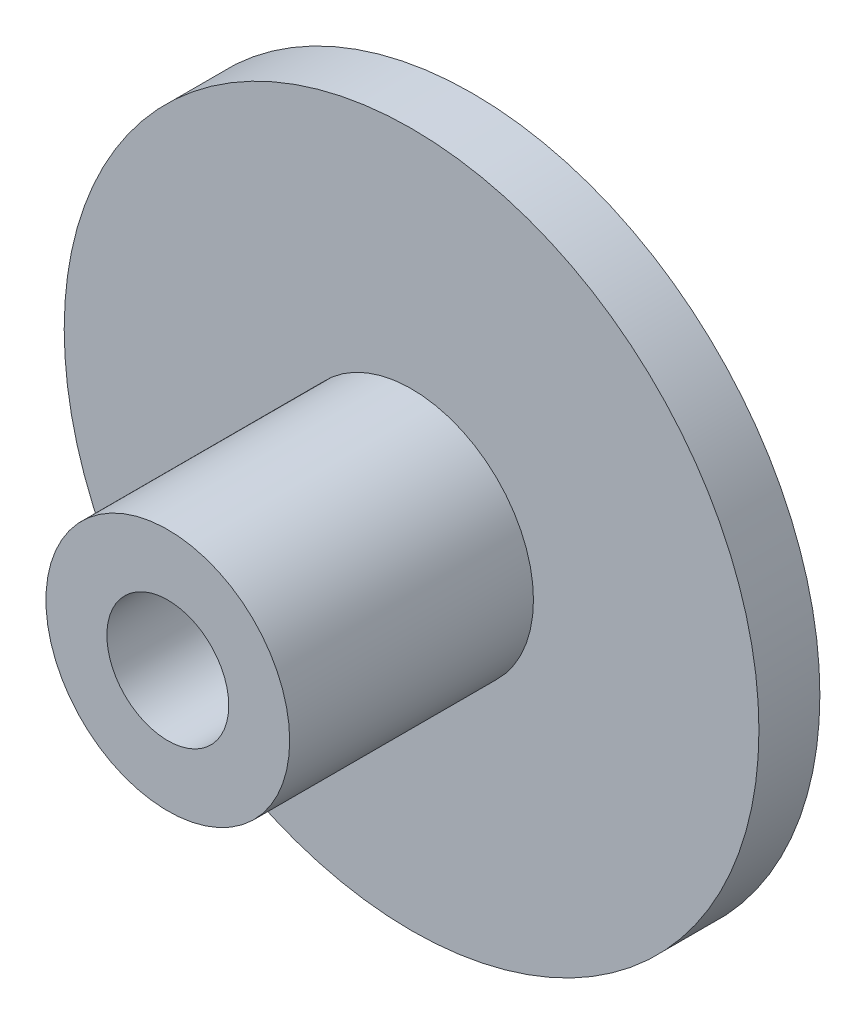
ISO-10303-21;
HEADER;
FILE_DESCRIPTION(('STEP AP214'),'2;1');
FILE_NAME('part.step','',(''),(''),'','','');
FILE_SCHEMA(('AUTOMOTIVE_DESIGN { 1 0 10303 214 1 1 1 1 }'));
ENDSEC;
DATA;
#1=APPLICATION_CONTEXT('core data for automotive mechanical design processes');
#2=APPLICATION_PROTOCOL_DEFINITION('international standard','automotive_design',2000,#1);
#3=PRODUCT_CONTEXT('',#1,'mechanical');
#4=PRODUCT('Part','Part','',(#3));
#5=PRODUCT_RELATED_PRODUCT_CATEGORY('part','',(#4));
#6=PRODUCT_DEFINITION_FORMATION('','',#4);
#7=PRODUCT_DEFINITION_CONTEXT('part definition',#1,'design');
#8=PRODUCT_DEFINITION('design','',#6,#7);
#9=PRODUCT_DEFINITION_SHAPE('','',#8);
#10=(LENGTH_UNIT() NAMED_UNIT(*) SI_UNIT(.MILLI.,.METRE.));
#11=(NAMED_UNIT(*) PLANE_ANGLE_UNIT() SI_UNIT($,.RADIAN.));
#12=(NAMED_UNIT(*) SI_UNIT($,.STERADIAN.) SOLID_ANGLE_UNIT());
#13=UNCERTAINTY_MEASURE_WITH_UNIT(LENGTH_MEASURE(1.E-05),#10,'distance_accuracy_value','');
#14=(GEOMETRIC_REPRESENTATION_CONTEXT(3) GLOBAL_UNCERTAINTY_ASSIGNED_CONTEXT((#13)) GLOBAL_UNIT_ASSIGNED_CONTEXT((#10,
#11,#12)) REPRESENTATION_CONTEXT('',''));
#15=CARTESIAN_POINT('',(0.,0.,0.));
#16=DIRECTION('',(0.,0.,1.));
#17=DIRECTION('',(1.,0.,0.));
#18=AXIS2_PLACEMENT_3D('',#15,#16,#17);
#19=CARTESIAN_POINT('',(0.,0.,5.));
#20=DIRECTION('',(0.,0.,-1.));
#21=DIRECTION('',(-1.,0.,0.));
#22=AXIS2_PLACEMENT_3D('',#19,#20,#21);
#23=CYLINDRICAL_SURFACE('',#22,28.5);
#24=CARTESIAN_POINT('',(0.,0.,5.));
#25=DIRECTION('',(0.,0.,1.));
#26=DIRECTION('',(1.,0.,0.));
#27=AXIS2_PLACEMENT_3D('',#24,#25,#26);
#28=CIRCLE('',#27,28.5);
#29=CARTESIAN_POINT('',(28.5,0.,5.));
#30=VERTEX_POINT('',#29);
#31=EDGE_CURVE('E10',#30,#30,#28,.T.);
#32=ORIENTED_EDGE('',*,*,#31,.F.);
#33=EDGE_LOOP('',(#32));
#34=FACE_BOUND('',#33,.T.);
#35=CARTESIAN_POINT('',(0.,0.,0.));
#36=DIRECTION('',(0.,0.,1.));
#37=DIRECTION('',(1.,0.,0.));
#38=AXIS2_PLACEMENT_3D('',#35,#36,#37);
#39=CIRCLE('',#38,28.5);
#40=CARTESIAN_POINT('',(28.5,0.,0.));
#41=VERTEX_POINT('',#40);
#42=EDGE_CURVE('E34',#41,#41,#39,.T.);
#43=ORIENTED_EDGE('',*,*,#42,.T.);
#44=EDGE_LOOP('',(#43));
#45=FACE_BOUND('',#44,.T.);
#46=ADVANCED_FACE('F31',(#34,#45),#23,.T.);
#47=CARTESIAN_POINT('',(0.,0.,5.));
#48=DIRECTION('',(0.,0.,1.));
#49=DIRECTION('',(1.,0.,0.));
#50=AXIS2_PLACEMENT_3D('',#47,#48,#49);
#51=PLANE('',#50);
#52=CARTESIAN_POINT('',(0.,0.,5.));
#53=DIRECTION('',(0.,0.,1.));
#54=DIRECTION('',(1.,0.,0.));
#55=AXIS2_PLACEMENT_3D('',#52,#53,#54);
#56=CIRCLE('',#55,10.);
#57=CARTESIAN_POINT('',(10.,0.,5.));
#58=VERTEX_POINT('',#57);
#59=EDGE_CURVE('E43',#58,#58,#56,.T.);
#60=ORIENTED_EDGE('',*,*,#59,.F.);
#61=EDGE_LOOP('',(#60));
#62=FACE_BOUND('',#61,.T.);
#63=ORIENTED_EDGE('',*,*,#31,.T.);
#64=EDGE_LOOP('',(#63));
#65=FACE_BOUND('',#64,.T.);
#66=ADVANCED_FACE('F76',(#62,#65),#51,.T.);
#67=CARTESIAN_POINT('',(0.,0.,0.));
#68=DIRECTION('',(0.,0.,1.));
#69=DIRECTION('',(1.,0.,0.));
#70=AXIS2_PLACEMENT_3D('',#67,#68,#69);
#71=PLANE('',#70);
#72=CARTESIAN_POINT('',(0.,0.,0.));
#73=DIRECTION('',(0.,0.,1.));
#74=DIRECTION('',(1.,0.,0.));
#75=AXIS2_PLACEMENT_3D('',#72,#73,#74);
#76=CIRCLE('',#75,5.);
#77=CARTESIAN_POINT('',(5.,0.,0.));
#78=VERTEX_POINT('',#77);
#79=EDGE_CURVE('E46',#78,#78,#76,.T.);
#80=ORIENTED_EDGE('',*,*,#79,.T.);
#81=EDGE_LOOP('',(#80));
#82=FACE_BOUND('',#81,.T.);
#83=ORIENTED_EDGE('',*,*,#42,.F.);
#84=EDGE_LOOP('',(#83));
#85=FACE_BOUND('',#84,.T.);
#86=ADVANCED_FACE('F55',(#82,#85),#71,.F.);
#87=CARTESIAN_POINT('',(0.,0.,25.));
#88=DIRECTION('',(0.,0.,-1.));
#89=DIRECTION('',(-1.,0.,0.));
#90=AXIS2_PLACEMENT_3D('',#87,#88,#89);
#91=CYLINDRICAL_SURFACE('',#90,10.);
#92=CARTESIAN_POINT('',(0.,0.,25.));
#93=DIRECTION('',(0.,0.,1.));
#94=DIRECTION('',(1.,0.,0.));
#95=AXIS2_PLACEMENT_3D('',#92,#93,#94);
#96=CIRCLE('',#95,10.);
#97=CARTESIAN_POINT('',(10.,0.,25.));
#98=VERTEX_POINT('',#97);
#99=EDGE_CURVE('E41',#98,#98,#96,.T.);
#100=ORIENTED_EDGE('',*,*,#99,.F.);
#101=EDGE_LOOP('',(#100));
#102=FACE_BOUND('',#101,.T.);
#103=ORIENTED_EDGE('',*,*,#59,.T.);
#104=EDGE_LOOP('',(#103));
#105=FACE_BOUND('',#104,.T.);
#106=ADVANCED_FACE('F67',(#102,#105),#91,.T.);
#107=CARTESIAN_POINT('',(0.,0.,25.));
#108=DIRECTION('',(0.,0.,1.));
#109=DIRECTION('',(1.,0.,0.));
#110=AXIS2_PLACEMENT_3D('',#107,#108,#109);
#111=PLANE('',#110);
#112=CARTESIAN_POINT('',(0.,0.,25.));
#113=DIRECTION('',(0.,0.,1.));
#114=DIRECTION('',(1.,0.,0.));
#115=AXIS2_PLACEMENT_3D('',#112,#113,#114);
#116=CIRCLE('',#115,5.);
#117=CARTESIAN_POINT('',(5.,0.,25.));
#118=VERTEX_POINT('',#117);
#119=EDGE_CURVE('E49',#118,#118,#116,.T.);
#120=ORIENTED_EDGE('',*,*,#119,.F.);
#121=EDGE_LOOP('',(#120));
#122=FACE_BOUND('',#121,.T.);
#123=ORIENTED_EDGE('',*,*,#99,.T.);
#124=EDGE_LOOP('',(#123));
#125=FACE_BOUND('',#124,.T.);
#126=ADVANCED_FACE('F61',(#122,#125),#111,.T.);
#127=CARTESIAN_POINT('',(0.,0.,0.));
#128=DIRECTION('',(0.,0.,1.));
#129=DIRECTION('',(1.,0.,0.));
#130=AXIS2_PLACEMENT_3D('',#127,#128,#129);
#131=CYLINDRICAL_SURFACE('',#130,5.);
#132=ORIENTED_EDGE('',*,*,#79,.F.);
#133=EDGE_LOOP('',(#132));
#134=FACE_BOUND('',#133,.T.);
#135=ORIENTED_EDGE('',*,*,#119,.T.);
#136=EDGE_LOOP('',(#135));
#137=FACE_BOUND('',#136,.T.);
#138=ADVANCED_FACE('F58',(#134,#137),#131,.F.);
#139=CLOSED_SHELL('',(#46,#66,#86,#106,#126,#138));
#140=MANIFOLD_SOLID_BREP('B2',#139);
#141=ADVANCED_BREP_SHAPE_REPRESENTATION('',(#18,#140),#14);
#142=SHAPE_DEFINITION_REPRESENTATION(#9,#141);
ENDSEC;
END-ISO-10303-21;
